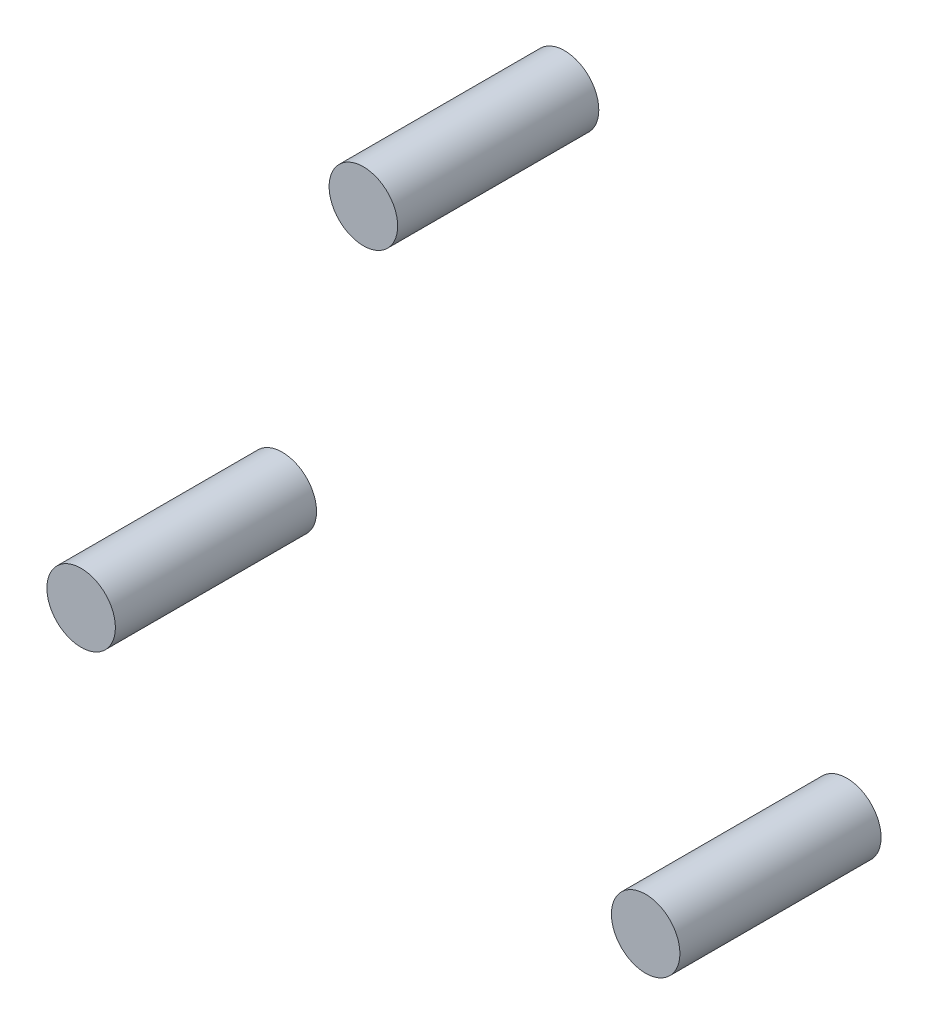
ISO-10303-21;
HEADER;
FILE_DESCRIPTION(('STEP AP214'),'2;1');
FILE_NAME('part.step','',(''),(''),'','','');
FILE_SCHEMA(('AUTOMOTIVE_DESIGN { 1 0 10303 214 1 1 1 1 }'));
ENDSEC;
DATA;
#1=APPLICATION_CONTEXT('core data for automotive mechanical design processes');
#2=APPLICATION_PROTOCOL_DEFINITION('international standard','automotive_design',2000,#1);
#3=PRODUCT_CONTEXT('',#1,'mechanical');
#4=PRODUCT('Part','Part','',(#3));
#5=PRODUCT_RELATED_PRODUCT_CATEGORY('part','',(#4));
#6=PRODUCT_DEFINITION_FORMATION('','',#4);
#7=PRODUCT_DEFINITION_CONTEXT('part definition',#1,'design');
#8=PRODUCT_DEFINITION('design','',#6,#7);
#9=PRODUCT_DEFINITION_SHAPE('','',#8);
#10=(LENGTH_UNIT() NAMED_UNIT(*) SI_UNIT(.MILLI.,.METRE.));
#11=(NAMED_UNIT(*) PLANE_ANGLE_UNIT() SI_UNIT($,.RADIAN.));
#12=(NAMED_UNIT(*) SI_UNIT($,.STERADIAN.) SOLID_ANGLE_UNIT());
#13=UNCERTAINTY_MEASURE_WITH_UNIT(LENGTH_MEASURE(1.E-05),#10,'distance_accuracy_value','');
#14=(GEOMETRIC_REPRESENTATION_CONTEXT(3) GLOBAL_UNCERTAINTY_ASSIGNED_CONTEXT((#13)) GLOBAL_UNIT_ASSIGNED_CONTEXT((#10,
#11,#12)) REPRESENTATION_CONTEXT('',''));
#15=CARTESIAN_POINT('',(0.,0.,0.));
#16=DIRECTION('',(0.,0.,1.));
#17=DIRECTION('',(1.,0.,0.));
#18=AXIS2_PLACEMENT_3D('',#15,#16,#17);
#19=CARTESIAN_POINT('',(4.4903417186223,-2.59250000000002,4.74149278298667));
#20=DIRECTION('',(0.,0.,-1.));
#21=DIRECTION('',(-1.,0.,0.));
#22=AXIS2_PLACEMENT_3D('',#19,#20,#21);
#23=CYLINDRICAL_SURFACE('',#22,0.544999999999999);
#24=CARTESIAN_POINT('',(4.4903417186223,-2.59250000000002,0.));
#25=DIRECTION('',(0.,0.,1.));
#26=DIRECTION('',(1.,0.,0.));
#27=AXIS2_PLACEMENT_3D('',#24,#25,#26);
#28=CIRCLE('',#27,0.544999999999999);
#29=CARTESIAN_POINT('',(5.0353417186223,-2.59250000000002,0.));
#30=VERTEX_POINT('',#29);
#31=EDGE_CURVE('E11',#30,#30,#28,.T.);
#32=ORIENTED_EDGE('',*,*,#31,.T.);
#33=EDGE_LOOP('',(#32));
#34=FACE_BOUND('',#33,.T.);
#35=CARTESIAN_POINT('',(4.4903417186223,-2.59250000000002,3.2));
#36=DIRECTION('',(0.,0.,1.));
#37=DIRECTION('',(1.,0.,0.));
#38=AXIS2_PLACEMENT_3D('',#35,#36,#37);
#39=CIRCLE('',#38,0.544999999999999);
#40=CARTESIAN_POINT('',(5.0353417186223,-2.59250000000002,3.2));
#41=VERTEX_POINT('',#40);
#42=EDGE_CURVE('E53',#41,#41,#39,.T.);
#43=ORIENTED_EDGE('',*,*,#42,.F.);
#44=EDGE_LOOP('',(#43));
#45=FACE_BOUND('',#44,.T.);
#46=ADVANCED_FACE('F46',(#34,#45),#23,.T.);
#47=CARTESIAN_POINT('',(4.4903417186223,-2.59250000000002,0.));
#48=DIRECTION('',(0.,0.,1.));
#49=DIRECTION('',(1.,0.,0.));
#50=AXIS2_PLACEMENT_3D('',#47,#48,#49);
#51=PLANE('',#50);
#52=ORIENTED_EDGE('',*,*,#31,.F.);
#53=EDGE_LOOP('',(#52));
#54=FACE_BOUND('',#53,.T.);
#55=ADVANCED_FACE('F48',(#54),#51,.F.);
#56=CARTESIAN_POINT('',(0.,0.,3.2));
#57=DIRECTION('',(0.,0.,1.));
#58=DIRECTION('',(0.,-1.,0.));
#59=AXIS2_PLACEMENT_3D('',#56,#57,#58);
#60=PLANE('',#59);
#61=ORIENTED_EDGE('',*,*,#42,.T.);
#62=EDGE_LOOP('',(#61));
#63=FACE_BOUND('',#62,.T.);
#64=ADVANCED_FACE('F59',(#63),#60,.T.);
#65=CLOSED_SHELL('',(#46,#55,#64));
#66=MANIFOLD_SOLID_BREP('B2',#65);
#67=CARTESIAN_POINT('',(0.,5.185,4.74149278298667));
#68=DIRECTION('',(0.,0.,-1.));
#69=DIRECTION('',(-1.,0.,0.));
#70=AXIS2_PLACEMENT_3D('',#67,#68,#69);
#71=CYLINDRICAL_SURFACE('',#70,0.544999999999999);
#72=CARTESIAN_POINT('',(0.,5.185,0.));
#73=DIRECTION('',(0.,0.,1.));
#74=DIRECTION('',(1.,0.,0.));
#75=AXIS2_PLACEMENT_3D('',#72,#73,#74);
#76=CIRCLE('',#75,0.544999999999999);
#77=CARTESIAN_POINT('',(0.544999999999997,5.185,0.));
#78=VERTEX_POINT('',#77);
#79=EDGE_CURVE('E45',#78,#78,#76,.T.);
#80=ORIENTED_EDGE('',*,*,#79,.T.);
#81=EDGE_LOOP('',(#80));
#82=FACE_BOUND('',#81,.T.);
#83=CARTESIAN_POINT('',(0.,5.185,3.2));
#84=DIRECTION('',(0.,0.,1.));
#85=DIRECTION('',(1.,0.,0.));
#86=AXIS2_PLACEMENT_3D('',#83,#84,#85);
#87=CIRCLE('',#86,0.544999999999999);
#88=CARTESIAN_POINT('',(0.544999999999997,5.185,3.2));
#89=VERTEX_POINT('',#88);
#90=EDGE_CURVE('E101',#89,#89,#87,.T.);
#91=ORIENTED_EDGE('',*,*,#90,.F.);
#92=EDGE_LOOP('',(#91));
#93=FACE_BOUND('',#92,.T.);
#94=ADVANCED_FACE('F94',(#82,#93),#71,.T.);
#95=CARTESIAN_POINT('',(0.,5.185,0.));
#96=DIRECTION('',(0.,0.,1.));
#97=DIRECTION('',(1.,0.,0.));
#98=AXIS2_PLACEMENT_3D('',#95,#96,#97);
#99=PLANE('',#98);
#100=ORIENTED_EDGE('',*,*,#79,.F.);
#101=EDGE_LOOP('',(#100));
#102=FACE_BOUND('',#101,.T.);
#103=ADVANCED_FACE('F96',(#102),#99,.F.);
#104=CARTESIAN_POINT('',(0.,0.,3.2));
#105=DIRECTION('',(0.,0.,1.));
#106=DIRECTION('',(0.,-1.,0.));
#107=AXIS2_PLACEMENT_3D('',#104,#105,#106);
#108=PLANE('',#107);
#109=ORIENTED_EDGE('',*,*,#90,.T.);
#110=EDGE_LOOP('',(#109));
#111=FACE_BOUND('',#110,.T.);
#112=ADVANCED_FACE('F107',(#111),#108,.T.);
#113=CLOSED_SHELL('',(#94,#103,#112));
#114=MANIFOLD_SOLID_BREP('B6',#113);
#115=CARTESIAN_POINT('',(-4.4903417186223,-2.59250000000002,4.74149278298667));
#116=DIRECTION('',(0.,0.,-1.));
#117=DIRECTION('',(-1.,0.,0.));
#118=AXIS2_PLACEMENT_3D('',#115,#116,#117);
#119=CYLINDRICAL_SURFACE('',#118,0.544999999999999);
#120=CARTESIAN_POINT('',(-4.4903417186223,-2.59250000000002,0.));
#121=DIRECTION('',(0.,0.,1.));
#122=DIRECTION('',(1.,0.,0.));
#123=AXIS2_PLACEMENT_3D('',#120,#121,#122);
#124=CIRCLE('',#123,0.544999999999999);
#125=CARTESIAN_POINT('',(-3.9453417186223,-2.59250000000002,0.));
#126=VERTEX_POINT('',#125);
#127=EDGE_CURVE('E142',#126,#126,#124,.T.);
#128=ORIENTED_EDGE('',*,*,#127,.T.);
#129=EDGE_LOOP('',(#128));
#130=FACE_BOUND('',#129,.T.);
#131=CARTESIAN_POINT('',(-4.4903417186223,-2.59250000000002,3.2));
#132=DIRECTION('',(0.,0.,1.));
#133=DIRECTION('',(1.,0.,0.));
#134=AXIS2_PLACEMENT_3D('',#131,#132,#133);
#135=CIRCLE('',#134,0.544999999999999);
#136=CARTESIAN_POINT('',(-3.9453417186223,-2.59250000000002,3.2));
#137=VERTEX_POINT('',#136);
#138=EDGE_CURVE('E93',#137,#137,#135,.T.);
#139=ORIENTED_EDGE('',*,*,#138,.F.);
#140=EDGE_LOOP('',(#139));
#141=FACE_BOUND('',#140,.T.);
#142=ADVANCED_FACE('F135',(#130,#141),#119,.T.);
#143=CARTESIAN_POINT('',(-4.4903417186223,-2.59250000000002,0.));
#144=DIRECTION('',(0.,0.,1.));
#145=DIRECTION('',(1.,0.,0.));
#146=AXIS2_PLACEMENT_3D('',#143,#144,#145);
#147=PLANE('',#146);
#148=ORIENTED_EDGE('',*,*,#127,.F.);
#149=EDGE_LOOP('',(#148));
#150=FACE_BOUND('',#149,.T.);
#151=ADVANCED_FACE('F150',(#150),#147,.F.);
#152=CARTESIAN_POINT('',(0.,0.,3.2));
#153=DIRECTION('',(0.,0.,1.));
#154=DIRECTION('',(0.,-1.,0.));
#155=AXIS2_PLACEMENT_3D('',#152,#153,#154);
#156=PLANE('',#155);
#157=ORIENTED_EDGE('',*,*,#138,.T.);
#158=EDGE_LOOP('',(#157));
#159=FACE_BOUND('',#158,.T.);
#160=ADVANCED_FACE('F137',(#159),#156,.T.);
#161=CLOSED_SHELL('',(#142,#151,#160));
#162=MANIFOLD_SOLID_BREP('B40',#161);
#163=ADVANCED_BREP_SHAPE_REPRESENTATION('',(#18,#66,#114,#162),#14);
#164=SHAPE_DEFINITION_REPRESENTATION(#9,#163);
ENDSEC;
END-ISO-10303-21;
